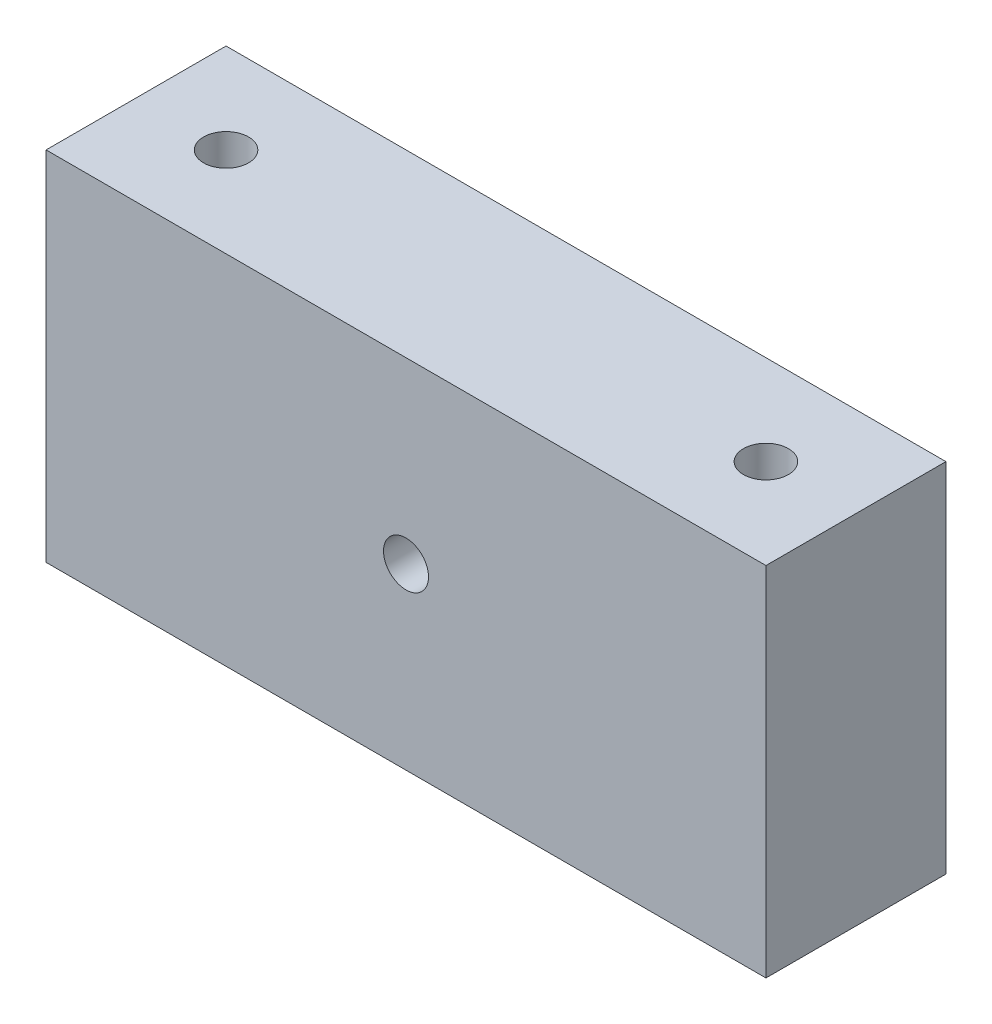
ISO-10303-21;
HEADER;
FILE_DESCRIPTION(('STEP AP214'),'2;1');
FILE_NAME('part.step','',(''),(''),'','','');
FILE_SCHEMA(('AUTOMOTIVE_DESIGN { 1 0 10303 214 1 1 1 1 }'));
ENDSEC;
DATA;
#1=APPLICATION_CONTEXT('core data for automotive mechanical design processes');
#2=APPLICATION_PROTOCOL_DEFINITION('international standard','automotive_design',2000,#1);
#3=PRODUCT_CONTEXT('',#1,'mechanical');
#4=PRODUCT('Part','Part','',(#3));
#5=PRODUCT_RELATED_PRODUCT_CATEGORY('part','',(#4));
#6=PRODUCT_DEFINITION_FORMATION('','',#4);
#7=PRODUCT_DEFINITION_CONTEXT('part definition',#1,'design');
#8=PRODUCT_DEFINITION('design','',#6,#7);
#9=PRODUCT_DEFINITION_SHAPE('','',#8);
#10=(LENGTH_UNIT() NAMED_UNIT(*) SI_UNIT(.MILLI.,.METRE.));
#11=(NAMED_UNIT(*) PLANE_ANGLE_UNIT() SI_UNIT($,.RADIAN.));
#12=(NAMED_UNIT(*) SI_UNIT($,.STERADIAN.) SOLID_ANGLE_UNIT());
#13=UNCERTAINTY_MEASURE_WITH_UNIT(LENGTH_MEASURE(1.E-05),#10,'distance_accuracy_value','');
#14=(GEOMETRIC_REPRESENTATION_CONTEXT(3) GLOBAL_UNCERTAINTY_ASSIGNED_CONTEXT((#13)) GLOBAL_UNIT_ASSIGNED_CONTEXT((#10,
#11,#12)) REPRESENTATION_CONTEXT('',''));
#15=CARTESIAN_POINT('',(0.,0.,0.));
#16=DIRECTION('',(0.,0.,1.));
#17=DIRECTION('',(1.,0.,0.));
#18=AXIS2_PLACEMENT_3D('',#15,#16,#17);
#19=CARTESIAN_POINT('',(0.,19.85,0.));
#20=DIRECTION('',(1.,0.,0.));
#21=DIRECTION('',(0.,0.,-1.));
#22=AXIS2_PLACEMENT_3D('',#19,#20,#21);
#23=PLANE('',#22);
#24=DIRECTION('',(0.,0.,1.));
#25=VECTOR('',#24,1.);
#26=CARTESIAN_POINT('',(0.,0.,0.));
#27=LINE('',#26,#25);
#28=CARTESIAN_POINT('',(0.,0.,-10.));
#29=VERTEX_POINT('',#28);
#30=CARTESIAN_POINT('',(0.,0.,0.));
#31=VERTEX_POINT('',#30);
#32=EDGE_CURVE('E100',#29,#31,#27,.T.);
#33=ORIENTED_EDGE('',*,*,#32,.T.);
#34=DIRECTION('',(0.,-1.,0.));
#35=VECTOR('',#34,1.);
#36=CARTESIAN_POINT('',(0.,19.85,0.));
#37=LINE('',#36,#35);
#38=CARTESIAN_POINT('',(0.,19.85,0.));
#39=VERTEX_POINT('',#38);
#40=EDGE_CURVE('E11',#39,#31,#37,.T.);
#41=ORIENTED_EDGE('',*,*,#40,.F.);
#42=DIRECTION('',(0.,0.,1.));
#43=VECTOR('',#42,1.);
#44=CARTESIAN_POINT('',(0.,19.85,0.));
#45=LINE('',#44,#43);
#46=CARTESIAN_POINT('',(0.,19.85,-10.));
#47=VERTEX_POINT('',#46);
#48=EDGE_CURVE('E88',#47,#39,#45,.T.);
#49=ORIENTED_EDGE('',*,*,#48,.F.);
#50=DIRECTION('',(0.,-1.,0.));
#51=VECTOR('',#50,1.);
#52=CARTESIAN_POINT('',(0.,19.85,-10.));
#53=LINE('',#52,#51);
#54=EDGE_CURVE('E96',#47,#29,#53,.T.);
#55=ORIENTED_EDGE('',*,*,#54,.T.);
#56=EDGE_LOOP('',(#33,#41,#49,#55));
#57=FACE_BOUND('',#56,.T.);
#58=ADVANCED_FACE('F37',(#57),#23,.F.);
#59=CARTESIAN_POINT('',(0.,19.85,0.));
#60=DIRECTION('',(0.,0.,-1.));
#61=DIRECTION('',(-1.,0.,0.));
#62=AXIS2_PLACEMENT_3D('',#59,#60,#61);
#63=PLANE('',#62);
#64=CARTESIAN_POINT('',(20.,9.92500000000001,0.));
#65=DIRECTION('',(0.,0.,-1.));
#66=DIRECTION('',(-1.,0.,0.));
#67=AXIS2_PLACEMENT_3D('',#64,#65,#66);
#68=CIRCLE('',#67,1.25);
#69=CARTESIAN_POINT('',(18.75,9.92500000000001,0.));
#70=VERTEX_POINT('',#69);
#71=EDGE_CURVE('E125',#70,#70,#68,.T.);
#72=ORIENTED_EDGE('',*,*,#71,.T.);
#73=EDGE_LOOP('',(#72));
#74=FACE_BOUND('',#73,.T.);
#75=DIRECTION('',(1.,0.,0.));
#76=VECTOR('',#75,1.);
#77=CARTESIAN_POINT('',(0.,0.,0.));
#78=LINE('',#77,#76);
#79=CARTESIAN_POINT('',(40.,0.,0.));
#80=VERTEX_POINT('',#79);
#81=EDGE_CURVE('E92',#31,#80,#78,.T.);
#82=ORIENTED_EDGE('',*,*,#81,.T.);
#83=DIRECTION('',(0.,-1.,0.));
#84=VECTOR('',#83,1.);
#85=CARTESIAN_POINT('',(40.,19.85,0.));
#86=LINE('',#85,#84);
#87=CARTESIAN_POINT('',(40.,19.85,0.));
#88=VERTEX_POINT('',#87);
#89=EDGE_CURVE('E45',#88,#80,#86,.T.);
#90=ORIENTED_EDGE('',*,*,#89,.F.);
#91=DIRECTION('',(1.,0.,0.));
#92=VECTOR('',#91,1.);
#93=CARTESIAN_POINT('',(0.,19.85,0.));
#94=LINE('',#93,#92);
#95=EDGE_CURVE('E83',#39,#88,#94,.T.);
#96=ORIENTED_EDGE('',*,*,#95,.F.);
#97=ORIENTED_EDGE('',*,*,#40,.T.);
#98=EDGE_LOOP('',(#82,#90,#96,#97));
#99=FACE_BOUND('',#98,.T.);
#100=ADVANCED_FACE('F91',(#74,#99),#63,.F.);
#101=CARTESIAN_POINT('',(40.,19.85,0.));
#102=DIRECTION('',(-1.,0.,0.));
#103=DIRECTION('',(0.,0.,1.));
#104=AXIS2_PLACEMENT_3D('',#101,#102,#103);
#105=PLANE('',#104);
#106=DIRECTION('',(0.,0.,-1.));
#107=VECTOR('',#106,1.);
#108=CARTESIAN_POINT('',(40.,0.,0.));
#109=LINE('',#108,#107);
#110=CARTESIAN_POINT('',(40.,0.,-10.));
#111=VERTEX_POINT('',#110);
#112=EDGE_CURVE('E70',#80,#111,#109,.T.);
#113=ORIENTED_EDGE('',*,*,#112,.T.);
#114=DIRECTION('',(0.,-1.,0.));
#115=VECTOR('',#114,1.);
#116=CARTESIAN_POINT('',(40.,19.85,-10.));
#117=LINE('',#116,#115);
#118=CARTESIAN_POINT('',(40.,19.85,-10.));
#119=VERTEX_POINT('',#118);
#120=EDGE_CURVE('E93',#119,#111,#117,.T.);
#121=ORIENTED_EDGE('',*,*,#120,.F.);
#122=DIRECTION('',(0.,0.,-1.));
#123=VECTOR('',#122,1.);
#124=CARTESIAN_POINT('',(40.,19.85,0.));
#125=LINE('',#124,#123);
#126=EDGE_CURVE('E86',#88,#119,#125,.T.);
#127=ORIENTED_EDGE('',*,*,#126,.F.);
#128=ORIENTED_EDGE('',*,*,#89,.T.);
#129=EDGE_LOOP('',(#113,#121,#127,#128));
#130=FACE_BOUND('',#129,.T.);
#131=ADVANCED_FACE('F94',(#130),#105,.F.);
#132=CARTESIAN_POINT('',(0.,19.85,-10.));
#133=DIRECTION('',(0.,0.,1.));
#134=DIRECTION('',(1.,0.,0.));
#135=AXIS2_PLACEMENT_3D('',#132,#133,#134);
#136=PLANE('',#135);
#137=CARTESIAN_POINT('',(20.,9.92500000000001,-10.));
#138=DIRECTION('',(0.,0.,-1.));
#139=DIRECTION('',(-1.,0.,0.));
#140=AXIS2_PLACEMENT_3D('',#137,#138,#139);
#141=CIRCLE('',#140,1.25);
#142=CARTESIAN_POINT('',(18.75,9.92500000000001,-10.));
#143=VERTEX_POINT('',#142);
#144=EDGE_CURVE('E128',#143,#143,#141,.T.);
#145=ORIENTED_EDGE('',*,*,#144,.F.);
#146=EDGE_LOOP('',(#145));
#147=FACE_BOUND('',#146,.T.);
#148=DIRECTION('',(-1.,0.,0.));
#149=VECTOR('',#148,1.);
#150=CARTESIAN_POINT('',(0.,0.,-10.));
#151=LINE('',#150,#149);
#152=EDGE_CURVE('E76',#111,#29,#151,.T.);
#153=ORIENTED_EDGE('',*,*,#152,.T.);
#154=ORIENTED_EDGE('',*,*,#54,.F.);
#155=DIRECTION('',(-1.,0.,0.));
#156=VECTOR('',#155,1.);
#157=CARTESIAN_POINT('',(0.,19.85,-10.));
#158=LINE('',#157,#156);
#159=EDGE_CURVE('E53',#119,#47,#158,.T.);
#160=ORIENTED_EDGE('',*,*,#159,.F.);
#161=ORIENTED_EDGE('',*,*,#120,.T.);
#162=EDGE_LOOP('',(#153,#154,#160,#161));
#163=FACE_BOUND('',#162,.T.);
#164=ADVANCED_FACE('F108',(#147,#163),#136,.F.);
#165=CARTESIAN_POINT('',(0.,19.85,0.));
#166=DIRECTION('',(0.,-1.,0.));
#167=DIRECTION('',(0.,0.,-1.));
#168=AXIS2_PLACEMENT_3D('',#165,#166,#167);
#169=PLANE('',#168);
#170=CARTESIAN_POINT('',(5.,19.85,-5.));
#171=DIRECTION('',(0.,1.,0.));
#172=DIRECTION('',(0.,0.,1.));
#173=AXIS2_PLACEMENT_3D('',#170,#171,#172);
#174=CIRCLE('',#173,1.25);
#175=CARTESIAN_POINT('',(5.,19.85,-3.75));
#176=VERTEX_POINT('',#175);
#177=EDGE_CURVE('E122',#176,#176,#174,.T.);
#178=ORIENTED_EDGE('',*,*,#177,.F.);
#179=EDGE_LOOP('',(#178));
#180=FACE_BOUND('',#179,.T.);
#181=CARTESIAN_POINT('',(35.,19.85,-5.));
#182=DIRECTION('',(0.,1.,0.));
#183=DIRECTION('',(0.,0.,1.));
#184=AXIS2_PLACEMENT_3D('',#181,#182,#183);
#185=CIRCLE('',#184,1.25);
#186=CARTESIAN_POINT('',(35.,19.85,-3.75));
#187=VERTEX_POINT('',#186);
#188=EDGE_CURVE('E116',#187,#187,#185,.T.);
#189=ORIENTED_EDGE('',*,*,#188,.F.);
#190=EDGE_LOOP('',(#189));
#191=FACE_BOUND('',#190,.T.);
#192=ORIENTED_EDGE('',*,*,#48,.T.);
#193=ORIENTED_EDGE('',*,*,#95,.T.);
#194=ORIENTED_EDGE('',*,*,#126,.T.);
#195=ORIENTED_EDGE('',*,*,#159,.T.);
#196=EDGE_LOOP('',(#192,#193,#194,#195));
#197=FACE_BOUND('',#196,.T.);
#198=ADVANCED_FACE('F84',(#180,#191,#197),#169,.F.);
#199=CARTESIAN_POINT('',(0.,0.,0.));
#200=DIRECTION('',(0.,-1.,0.));
#201=DIRECTION('',(0.,0.,-1.));
#202=AXIS2_PLACEMENT_3D('',#199,#200,#201);
#203=PLANE('',#202);
#204=CARTESIAN_POINT('',(5.,0.,-5.));
#205=DIRECTION('',(0.,1.,0.));
#206=DIRECTION('',(0.,0.,1.));
#207=AXIS2_PLACEMENT_3D('',#204,#205,#206);
#208=CIRCLE('',#207,1.25);
#209=CARTESIAN_POINT('',(5.,0.,-3.75));
#210=VERTEX_POINT('',#209);
#211=EDGE_CURVE('E119',#210,#210,#208,.T.);
#212=ORIENTED_EDGE('',*,*,#211,.T.);
#213=EDGE_LOOP('',(#212));
#214=FACE_BOUND('',#213,.T.);
#215=CARTESIAN_POINT('',(35.,0.,-5.));
#216=DIRECTION('',(0.,1.,0.));
#217=DIRECTION('',(0.,0.,1.));
#218=AXIS2_PLACEMENT_3D('',#215,#216,#217);
#219=CIRCLE('',#218,1.24999999999999);
#220=CARTESIAN_POINT('',(35.,0.,-3.75000000000001));
#221=VERTEX_POINT('',#220);
#222=EDGE_CURVE('E103',#221,#221,#219,.T.);
#223=ORIENTED_EDGE('',*,*,#222,.T.);
#224=EDGE_LOOP('',(#223));
#225=FACE_BOUND('',#224,.T.);
#226=ORIENTED_EDGE('',*,*,#32,.F.);
#227=ORIENTED_EDGE('',*,*,#152,.F.);
#228=ORIENTED_EDGE('',*,*,#112,.F.);
#229=ORIENTED_EDGE('',*,*,#81,.F.);
#230=EDGE_LOOP('',(#226,#227,#228,#229));
#231=FACE_BOUND('',#230,.T.);
#232=ADVANCED_FACE('F111',(#214,#225,#231),#203,.T.);
#233=CARTESIAN_POINT('',(35.,19.85,-5.));
#234=DIRECTION('',(0.,1.,0.));
#235=DIRECTION('',(0.,0.,1.));
#236=AXIS2_PLACEMENT_3D('',#233,#234,#235);
#237=CYLINDRICAL_SURFACE('',#236,1.25);
#238=ORIENTED_EDGE('',*,*,#222,.F.);
#239=EDGE_LOOP('',(#238));
#240=FACE_BOUND('',#239,.T.);
#241=ORIENTED_EDGE('',*,*,#188,.T.);
#242=EDGE_LOOP('',(#241));
#243=FACE_BOUND('',#242,.T.);
#244=ADVANCED_FACE('F159',(#240,#243),#237,.F.);
#245=CARTESIAN_POINT('',(5.,19.85,-5.));
#246=DIRECTION('',(0.,1.,0.));
#247=DIRECTION('',(0.,0.,1.));
#248=AXIS2_PLACEMENT_3D('',#245,#246,#247);
#249=CYLINDRICAL_SURFACE('',#248,1.25);
#250=ORIENTED_EDGE('',*,*,#211,.F.);
#251=EDGE_LOOP('',(#250));
#252=FACE_BOUND('',#251,.T.);
#253=ORIENTED_EDGE('',*,*,#177,.T.);
#254=EDGE_LOOP('',(#253));
#255=FACE_BOUND('',#254,.T.);
#256=ADVANCED_FACE('F154',(#252,#255),#249,.F.);
#257=CARTESIAN_POINT('',(20.,9.92500000000001,-10.));
#258=DIRECTION('',(0.,0.,-1.));
#259=DIRECTION('',(-1.,0.,0.));
#260=AXIS2_PLACEMENT_3D('',#257,#258,#259);
#261=CYLINDRICAL_SURFACE('',#260,1.25);
#262=ORIENTED_EDGE('',*,*,#71,.F.);
#263=EDGE_LOOP('',(#262));
#264=FACE_BOUND('',#263,.T.);
#265=ORIENTED_EDGE('',*,*,#144,.T.);
#266=EDGE_LOOP('',(#265));
#267=FACE_BOUND('',#266,.T.);
#268=ADVANCED_FACE('F132',(#264,#267),#261,.F.);
#269=CLOSED_SHELL('',(#58,#100,#131,#164,#198,#232,#244,#256,#268));
#270=MANIFOLD_SOLID_BREP('B2',#269);
#271=ADVANCED_BREP_SHAPE_REPRESENTATION('',(#18,#270),#14);
#272=SHAPE_DEFINITION_REPRESENTATION(#9,#271);
ENDSEC;
END-ISO-10303-21;
